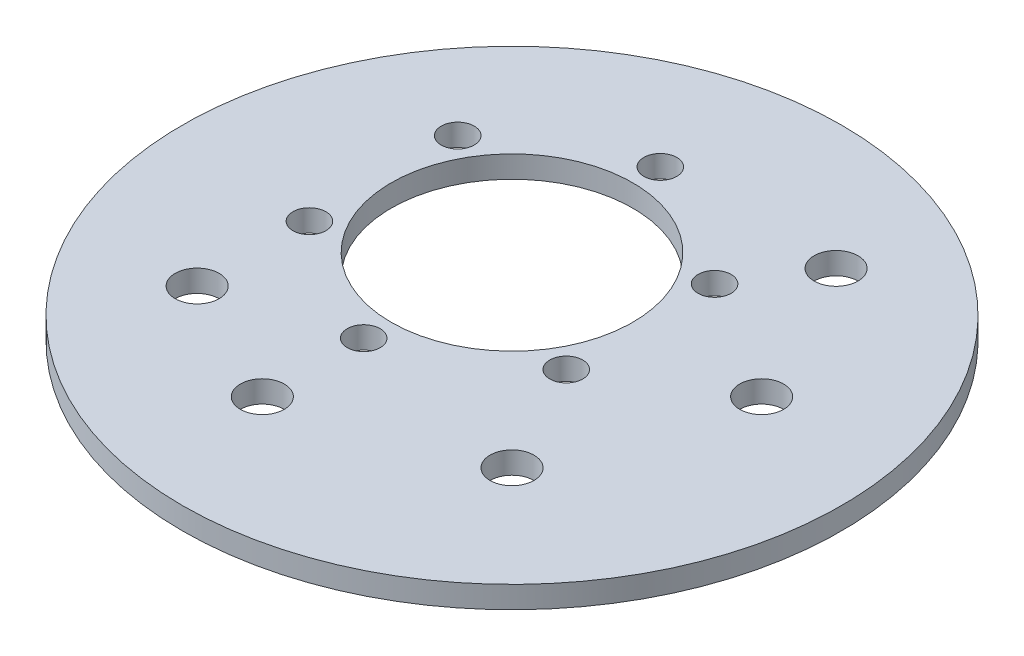
ISO-10303-21;
HEADER;
FILE_DESCRIPTION(('STEP AP214'),'2;1');
FILE_NAME('part.step','',(''),(''),'','','');
FILE_SCHEMA(('AUTOMOTIVE_DESIGN { 1 0 10303 214 1 1 1 1 }'));
ENDSEC;
DATA;
#1=APPLICATION_CONTEXT('core data for automotive mechanical design processes');
#2=APPLICATION_PROTOCOL_DEFINITION('international standard','automotive_design',2000,#1);
#3=PRODUCT_CONTEXT('',#1,'mechanical');
#4=PRODUCT('Part','Part','',(#3));
#5=PRODUCT_RELATED_PRODUCT_CATEGORY('part','',(#4));
#6=PRODUCT_DEFINITION_FORMATION('','',#4);
#7=PRODUCT_DEFINITION_CONTEXT('part definition',#1,'design');
#8=PRODUCT_DEFINITION('design','',#6,#7);
#9=PRODUCT_DEFINITION_SHAPE('','',#8);
#10=(LENGTH_UNIT() NAMED_UNIT(*) SI_UNIT(.MILLI.,.METRE.));
#11=(NAMED_UNIT(*) PLANE_ANGLE_UNIT() SI_UNIT($,.RADIAN.));
#12=(NAMED_UNIT(*) SI_UNIT($,.STERADIAN.) SOLID_ANGLE_UNIT());
#13=UNCERTAINTY_MEASURE_WITH_UNIT(LENGTH_MEASURE(1.E-05),#10,'distance_accuracy_value','');
#14=(GEOMETRIC_REPRESENTATION_CONTEXT(3) GLOBAL_UNCERTAINTY_ASSIGNED_CONTEXT((#13)) GLOBAL_UNIT_ASSIGNED_CONTEXT((#10,
#11,#12)) REPRESENTATION_CONTEXT('',''));
#15=CARTESIAN_POINT('',(0.,0.,0.));
#16=DIRECTION('',(0.,0.,1.));
#17=DIRECTION('',(1.,0.,0.));
#18=AXIS2_PLACEMENT_3D('',#15,#16,#17);
#19=CARTESIAN_POINT('',(0.,2.,0.));
#20=DIRECTION('',(0.,-1.,0.));
#21=DIRECTION('',(0.,0.,-1.));
#22=AXIS2_PLACEMENT_3D('',#19,#20,#21);
#23=CYLINDRICAL_SURFACE('',#22,30.);
#24=CARTESIAN_POINT('',(0.,2.,0.));
#25=DIRECTION('',(0.,1.,0.));
#26=DIRECTION('',(0.,0.,1.));
#27=AXIS2_PLACEMENT_3D('',#24,#25,#26);
#28=CIRCLE('',#27,30.);
#29=CARTESIAN_POINT('',(0.,2.,30.));
#30=VERTEX_POINT('',#29);
#31=EDGE_CURVE('E11',#30,#30,#28,.T.);
#32=ORIENTED_EDGE('',*,*,#31,.F.);
#33=EDGE_LOOP('',(#32));
#34=FACE_BOUND('',#33,.T.);
#35=CARTESIAN_POINT('',(0.,0.,0.));
#36=DIRECTION('',(0.,1.,0.));
#37=DIRECTION('',(0.,0.,1.));
#38=AXIS2_PLACEMENT_3D('',#35,#36,#37);
#39=CIRCLE('',#38,30.);
#40=CARTESIAN_POINT('',(0.,0.,30.));
#41=VERTEX_POINT('',#40);
#42=EDGE_CURVE('E59',#41,#41,#39,.T.);
#43=ORIENTED_EDGE('',*,*,#42,.T.);
#44=EDGE_LOOP('',(#43));
#45=FACE_BOUND('',#44,.T.);
#46=ADVANCED_FACE('F56',(#34,#45),#23,.T.);
#47=CARTESIAN_POINT('',(0.,2.,0.));
#48=DIRECTION('',(0.,1.,0.));
#49=DIRECTION('',(0.,0.,1.));
#50=AXIS2_PLACEMENT_3D('',#47,#48,#49);
#51=PLANE('',#50);
#52=CARTESIAN_POINT('',(-4.94974746830583,2.,-18.4497474683058));
#53=DIRECTION('',(0.,1.,0.));
#54=DIRECTION('',(0.,0.,1.));
#55=AXIS2_PLACEMENT_3D('',#52,#53,#54);
#56=CIRCLE('',#55,1.5);
#57=CARTESIAN_POINT('',(-4.94974746830583,2.,-16.9497474683058));
#58=VERTEX_POINT('',#57);
#59=EDGE_CURVE('E102',#58,#58,#56,.T.);
#60=ORIENTED_EDGE('',*,*,#59,.F.);
#61=EDGE_LOOP('',(#60));
#62=FACE_BOUND('',#61,.T.);
#63=CARTESIAN_POINT('',(-16.6410904193954,2.,-11.6997474683055));
#64=DIRECTION('',(0.,1.,0.));
#65=DIRECTION('',(0.,0.,1.));
#66=AXIS2_PLACEMENT_3D('',#63,#64,#65);
#67=CIRCLE('',#66,1.5);
#68=CARTESIAN_POINT('',(-16.6410904193954,2.,-10.1997474683055));
#69=VERTEX_POINT('',#68);
#70=EDGE_CURVE('E101',#69,#69,#67,.T.);
#71=ORIENTED_EDGE('',*,*,#70,.F.);
#72=EDGE_LOOP('',(#71));
#73=FACE_BOUND('',#72,.T.);
#74=CARTESIAN_POINT('',(-16.6410904193957,2.,1.80025253169417));
#75=DIRECTION('',(0.,1.,0.));
#76=DIRECTION('',(0.,0.,1.));
#77=AXIS2_PLACEMENT_3D('',#74,#75,#76);
#78=CIRCLE('',#77,1.49999999999916);
#79=CARTESIAN_POINT('',(-16.6410904193957,2.,3.30025253169333));
#80=VERTEX_POINT('',#79);
#81=EDGE_CURVE('E109',#80,#80,#78,.T.);
#82=ORIENTED_EDGE('',*,*,#81,.F.);
#83=EDGE_LOOP('',(#82));
#84=FACE_BOUND('',#83,.T.);
#85=CARTESIAN_POINT('',(-4.94974746830583,2.,8.55025253169416));
#86=DIRECTION('',(0.,1.,0.));
#87=DIRECTION('',(0.,0.,1.));
#88=AXIS2_PLACEMENT_3D('',#85,#86,#87);
#89=CIRCLE('',#88,1.499999999999);
#90=CARTESIAN_POINT('',(-4.94974746830583,2.,10.0502525316932));
#91=VERTEX_POINT('',#90);
#92=EDGE_CURVE('E115',#91,#91,#89,.T.);
#93=ORIENTED_EDGE('',*,*,#92,.F.);
#94=EDGE_LOOP('',(#93));
#95=FACE_BOUND('',#94,.T.);
#96=CARTESIAN_POINT('',(6.74159548278409,2.,1.80025253169416));
#97=DIRECTION('',(0.,1.,0.));
#98=DIRECTION('',(0.,0.,1.));
#99=AXIS2_PLACEMENT_3D('',#96,#97,#98);
#100=CIRCLE('',#99,1.49999999999939);
#101=CARTESIAN_POINT('',(6.74159548278409,2.,3.30025253169355));
#102=VERTEX_POINT('',#101);
#103=EDGE_CURVE('E78',#102,#102,#100,.T.);
#104=ORIENTED_EDGE('',*,*,#103,.F.);
#105=EDGE_LOOP('',(#104));
#106=FACE_BOUND('',#105,.T.);
#107=CARTESIAN_POINT('',(17.7776770206899,2.,-4.94974746830584));
#108=DIRECTION('',(0.,1.,0.));
#109=DIRECTION('',(0.,0.,1.));
#110=AXIS2_PLACEMENT_3D('',#107,#108,#109);
#111=CIRCLE('',#110,2.);
#112=CARTESIAN_POINT('',(17.7776770206899,2.,-2.94974746830583));
#113=VERTEX_POINT('',#112);
#114=EDGE_CURVE('E77',#113,#113,#111,.T.);
#115=ORIENTED_EDGE('',*,*,#114,.F.);
#116=EDGE_LOOP('',(#115));
#117=FACE_BOUND('',#116,.T.);
#118=CARTESIAN_POINT('',(12.0208152801713,2.,12.0208152801713));
#119=DIRECTION('',(0.,1.,0.));
#120=DIRECTION('',(0.,0.,1.));
#121=AXIS2_PLACEMENT_3D('',#118,#119,#120);
#122=CIRCLE('',#121,2.);
#123=CARTESIAN_POINT('',(12.0208152801713,2.,14.0208152801713));
#124=VERTEX_POINT('',#123);
#125=EDGE_CURVE('E85',#124,#124,#122,.T.);
#126=ORIENTED_EDGE('',*,*,#125,.F.);
#127=EDGE_LOOP('',(#126));
#128=FACE_BOUND('',#127,.T.);
#129=CARTESIAN_POINT('',(-4.94974746830583,2.,17.77767702069));
#130=DIRECTION('',(0.,1.,0.));
#131=DIRECTION('',(0.,0.,1.));
#132=AXIS2_PLACEMENT_3D('',#129,#130,#131);
#133=CIRCLE('',#132,2.);
#134=CARTESIAN_POINT('',(-4.94974746830583,2.,19.77767702069));
#135=VERTEX_POINT('',#134);
#136=EDGE_CURVE('E91',#135,#135,#133,.T.);
#137=ORIENTED_EDGE('',*,*,#136,.F.);
#138=EDGE_LOOP('',(#137));
#139=FACE_BOUND('',#138,.T.);
#140=CARTESIAN_POINT('',(-4.94974746830583,2.,-4.94974746830584));
#141=DIRECTION('',(0.,1.,0.));
#142=DIRECTION('',(0.,0.,1.));
#143=AXIS2_PLACEMENT_3D('',#140,#141,#142);
#144=CIRCLE('',#143,11.);
#145=CARTESIAN_POINT('',(-4.94974746830583,2.,6.05025253169416));
#146=VERTEX_POINT('',#145);
#147=EDGE_CURVE('E125',#146,#146,#144,.T.);
#148=ORIENTED_EDGE('',*,*,#147,.F.);
#149=EDGE_LOOP('',(#148));
#150=FACE_BOUND('',#149,.T.);
#151=CARTESIAN_POINT('',(6.7415954827844,2.,-11.6997474683063));
#152=DIRECTION('',(0.,1.,0.));
#153=DIRECTION('',(0.,0.,1.));
#154=AXIS2_PLACEMENT_3D('',#151,#152,#153);
#155=CIRCLE('',#154,1.5);
#156=CARTESIAN_POINT('',(6.7415954827844,2.,-10.1997474683063));
#157=VERTEX_POINT('',#156);
#158=EDGE_CURVE('E131',#157,#157,#155,.T.);
#159=ORIENTED_EDGE('',*,*,#158,.F.);
#160=EDGE_LOOP('',(#159));
#161=FACE_BOUND('',#160,.T.);
#162=CARTESIAN_POINT('',(11.0502525316942,2.,-18.4497474683058));
#163=DIRECTION('',(0.,1.,0.));
#164=DIRECTION('',(0.,0.,1.));
#165=AXIS2_PLACEMENT_3D('',#162,#163,#164);
#166=CIRCLE('',#165,2.);
#167=CARTESIAN_POINT('',(11.0502525316942,2.,-16.4497474683058));
#168=VERTEX_POINT('',#167);
#169=EDGE_CURVE('E126',#168,#168,#166,.T.);
#170=ORIENTED_EDGE('',*,*,#169,.F.);
#171=EDGE_LOOP('',(#170));
#172=FACE_BOUND('',#171,.T.);
#173=CARTESIAN_POINT('',(-16.6410904193957,2.,12.0208152801713));
#174=DIRECTION('',(0.,1.,0.));
#175=DIRECTION('',(0.,0.,1.));
#176=AXIS2_PLACEMENT_3D('',#173,#174,#175);
#177=CIRCLE('',#176,2.);
#178=CARTESIAN_POINT('',(-16.6410904193957,2.,14.0208152801713));
#179=VERTEX_POINT('',#178);
#180=EDGE_CURVE('E70',#179,#179,#177,.T.);
#181=ORIENTED_EDGE('',*,*,#180,.F.);
#182=EDGE_LOOP('',(#181));
#183=FACE_BOUND('',#182,.T.);
#184=ORIENTED_EDGE('',*,*,#31,.T.);
#185=EDGE_LOOP('',(#184));
#186=FACE_BOUND('',#185,.T.);
#187=ADVANCED_FACE('F143',(#62,#73,#84,#95,#106,#117,#128,#139,#150,#161,#172,#183,#186),#51,.T.);
#188=CARTESIAN_POINT('',(0.,0.,0.));
#189=DIRECTION('',(0.,1.,0.));
#190=DIRECTION('',(0.,0.,1.));
#191=AXIS2_PLACEMENT_3D('',#188,#189,#190);
#192=PLANE('',#191);
#193=CARTESIAN_POINT('',(-4.94974746830583,0.,-18.4497474683058));
#194=DIRECTION('',(0.,1.,0.));
#195=DIRECTION('',(0.,0.,1.));
#196=AXIS2_PLACEMENT_3D('',#193,#194,#195);
#197=CIRCLE('',#196,1.5);
#198=CARTESIAN_POINT('',(-4.94974746830583,0.,-16.9497474683058));
#199=VERTEX_POINT('',#198);
#200=EDGE_CURVE('E98',#199,#199,#197,.F.);
#201=ORIENTED_EDGE('',*,*,#200,.F.);
#202=EDGE_LOOP('',(#201));
#203=FACE_BOUND('',#202,.T.);
#204=CARTESIAN_POINT('',(-16.6410904193954,0.,-11.6997474683055));
#205=DIRECTION('',(0.,1.,0.));
#206=DIRECTION('',(0.,0.,1.));
#207=AXIS2_PLACEMENT_3D('',#204,#205,#206);
#208=CIRCLE('',#207,1.5);
#209=CARTESIAN_POINT('',(-16.6410904193954,0.,-10.1997474683055));
#210=VERTEX_POINT('',#209);
#211=EDGE_CURVE('E106',#210,#210,#208,.F.);
#212=ORIENTED_EDGE('',*,*,#211,.F.);
#213=EDGE_LOOP('',(#212));
#214=FACE_BOUND('',#213,.T.);
#215=CARTESIAN_POINT('',(-16.6410904193957,0.,1.80025253169417));
#216=DIRECTION('',(0.,1.,0.));
#217=DIRECTION('',(0.,0.,1.));
#218=AXIS2_PLACEMENT_3D('',#215,#216,#217);
#219=CIRCLE('',#218,1.49999999999916);
#220=CARTESIAN_POINT('',(-16.6410904193957,0.,3.30025253169333));
#221=VERTEX_POINT('',#220);
#222=EDGE_CURVE('E112',#221,#221,#219,.F.);
#223=ORIENTED_EDGE('',*,*,#222,.F.);
#224=EDGE_LOOP('',(#223));
#225=FACE_BOUND('',#224,.T.);
#226=CARTESIAN_POINT('',(-4.94974746830583,0.,8.55025253169416));
#227=DIRECTION('',(0.,1.,0.));
#228=DIRECTION('',(0.,0.,1.));
#229=AXIS2_PLACEMENT_3D('',#226,#227,#228);
#230=CIRCLE('',#229,1.499999999999);
#231=CARTESIAN_POINT('',(-4.94974746830583,0.,10.0502525316932));
#232=VERTEX_POINT('',#231);
#233=EDGE_CURVE('E81',#232,#232,#230,.F.);
#234=ORIENTED_EDGE('',*,*,#233,.F.);
#235=EDGE_LOOP('',(#234));
#236=FACE_BOUND('',#235,.T.);
#237=CARTESIAN_POINT('',(6.74159548278409,0.,1.80025253169416));
#238=DIRECTION('',(0.,1.,0.));
#239=DIRECTION('',(0.,0.,1.));
#240=AXIS2_PLACEMENT_3D('',#237,#238,#239);
#241=CIRCLE('',#240,1.49999999999939);
#242=CARTESIAN_POINT('',(6.74159548278409,0.,3.30025253169355));
#243=VERTEX_POINT('',#242);
#244=EDGE_CURVE('E74',#243,#243,#241,.F.);
#245=ORIENTED_EDGE('',*,*,#244,.F.);
#246=EDGE_LOOP('',(#245));
#247=FACE_BOUND('',#246,.T.);
#248=CARTESIAN_POINT('',(17.7776770206899,0.,-4.94974746830584));
#249=DIRECTION('',(0.,1.,0.));
#250=DIRECTION('',(0.,0.,1.));
#251=AXIS2_PLACEMENT_3D('',#248,#249,#250);
#252=CIRCLE('',#251,2.);
#253=CARTESIAN_POINT('',(17.7776770206899,0.,-2.94974746830583));
#254=VERTEX_POINT('',#253);
#255=EDGE_CURVE('E82',#254,#254,#252,.F.);
#256=ORIENTED_EDGE('',*,*,#255,.F.);
#257=EDGE_LOOP('',(#256));
#258=FACE_BOUND('',#257,.T.);
#259=CARTESIAN_POINT('',(12.0208152801713,0.,12.0208152801713));
#260=DIRECTION('',(0.,1.,0.));
#261=DIRECTION('',(0.,0.,1.));
#262=AXIS2_PLACEMENT_3D('',#259,#260,#261);
#263=CIRCLE('',#262,2.);
#264=CARTESIAN_POINT('',(12.0208152801713,0.,14.0208152801713));
#265=VERTEX_POINT('',#264);
#266=EDGE_CURVE('E88',#265,#265,#263,.F.);
#267=ORIENTED_EDGE('',*,*,#266,.F.);
#268=EDGE_LOOP('',(#267));
#269=FACE_BOUND('',#268,.T.);
#270=CARTESIAN_POINT('',(-4.94974746830583,0.,17.77767702069));
#271=DIRECTION('',(0.,1.,0.));
#272=DIRECTION('',(0.,0.,1.));
#273=AXIS2_PLACEMENT_3D('',#270,#271,#272);
#274=CIRCLE('',#273,2.);
#275=CARTESIAN_POINT('',(-4.94974746830583,0.,19.77767702069));
#276=VERTEX_POINT('',#275);
#277=EDGE_CURVE('E73',#276,#276,#274,.F.);
#278=ORIENTED_EDGE('',*,*,#277,.F.);
#279=EDGE_LOOP('',(#278));
#280=FACE_BOUND('',#279,.T.);
#281=CARTESIAN_POINT('',(-4.94974746830583,0.,-4.94974746830584));
#282=DIRECTION('',(0.,1.,0.));
#283=DIRECTION('',(0.,0.,1.));
#284=AXIS2_PLACEMENT_3D('',#281,#282,#283);
#285=CIRCLE('',#284,11.);
#286=CARTESIAN_POINT('',(-4.94974746830583,0.,6.05025253169416));
#287=VERTEX_POINT('',#286);
#288=EDGE_CURVE('E134',#287,#287,#285,.F.);
#289=ORIENTED_EDGE('',*,*,#288,.F.);
#290=EDGE_LOOP('',(#289));
#291=FACE_BOUND('',#290,.T.);
#292=CARTESIAN_POINT('',(6.7415954827844,0.,-11.6997474683063));
#293=DIRECTION('',(0.,1.,0.));
#294=DIRECTION('',(0.,0.,1.));
#295=AXIS2_PLACEMENT_3D('',#292,#293,#294);
#296=CIRCLE('',#295,1.5);
#297=CARTESIAN_POINT('',(6.7415954827844,0.,-10.1997474683063));
#298=VERTEX_POINT('',#297);
#299=EDGE_CURVE('E105',#298,#298,#296,.F.);
#300=ORIENTED_EDGE('',*,*,#299,.F.);
#301=EDGE_LOOP('',(#300));
#302=FACE_BOUND('',#301,.T.);
#303=CARTESIAN_POINT('',(11.0502525316942,0.,-18.4497474683058));
#304=DIRECTION('',(0.,1.,0.));
#305=DIRECTION('',(0.,0.,1.));
#306=AXIS2_PLACEMENT_3D('',#303,#304,#305);
#307=CIRCLE('',#306,2.);
#308=CARTESIAN_POINT('',(11.0502525316942,0.,-16.4497474683058));
#309=VERTEX_POINT('',#308);
#310=EDGE_CURVE('E122',#309,#309,#307,.F.);
#311=ORIENTED_EDGE('',*,*,#310,.F.);
#312=EDGE_LOOP('',(#311));
#313=FACE_BOUND('',#312,.T.);
#314=CARTESIAN_POINT('',(-16.6410904193957,0.,12.0208152801713));
#315=DIRECTION('',(0.,1.,0.));
#316=DIRECTION('',(0.,0.,1.));
#317=AXIS2_PLACEMENT_3D('',#314,#315,#316);
#318=CIRCLE('',#317,2.);
#319=CARTESIAN_POINT('',(-16.6410904193957,0.,14.0208152801713));
#320=VERTEX_POINT('',#319);
#321=EDGE_CURVE('E66',#320,#320,#318,.F.);
#322=ORIENTED_EDGE('',*,*,#321,.F.);
#323=EDGE_LOOP('',(#322));
#324=FACE_BOUND('',#323,.T.);
#325=ORIENTED_EDGE('',*,*,#42,.F.);
#326=EDGE_LOOP('',(#325));
#327=FACE_BOUND('',#326,.T.);
#328=ADVANCED_FACE('F146',(#203,#214,#225,#236,#247,#258,#269,#280,#291,#302,#313,#324,#327),
#192,.F.);
#329=CARTESIAN_POINT('',(-16.6410904193957,-0.00100000000000013,12.0208152801713));
#330=DIRECTION('',(0.,1.,0.));
#331=DIRECTION('',(0.,0.,1.));
#332=AXIS2_PLACEMENT_3D('',#329,#330,#331);
#333=CYLINDRICAL_SURFACE('',#332,2.);
#334=ORIENTED_EDGE('',*,*,#180,.T.);
#335=EDGE_LOOP('',(#334));
#336=FACE_BOUND('',#335,.T.);
#337=ORIENTED_EDGE('',*,*,#321,.T.);
#338=EDGE_LOOP('',(#337));
#339=FACE_BOUND('',#338,.T.);
#340=ADVANCED_FACE('F155',(#336,#339),#333,.F.);
#341=CARTESIAN_POINT('',(11.0502525316942,-0.00100000000000013,-18.4497474683058));
#342=DIRECTION('',(0.,1.,0.));
#343=DIRECTION('',(0.,0.,1.));
#344=AXIS2_PLACEMENT_3D('',#341,#342,#343);
#345=CYLINDRICAL_SURFACE('',#344,2.);
#346=ORIENTED_EDGE('',*,*,#169,.T.);
#347=EDGE_LOOP('',(#346));
#348=FACE_BOUND('',#347,.T.);
#349=ORIENTED_EDGE('',*,*,#310,.T.);
#350=EDGE_LOOP('',(#349));
#351=FACE_BOUND('',#350,.T.);
#352=ADVANCED_FACE('F158',(#348,#351),#345,.F.);
#353=CARTESIAN_POINT('',(6.7415954827844,-0.00100000000000013,-11.6997474683063));
#354=DIRECTION('',(0.,1.,0.));
#355=DIRECTION('',(0.,0.,1.));
#356=AXIS2_PLACEMENT_3D('',#353,#354,#355);
#357=CYLINDRICAL_SURFACE('',#356,1.5);
#358=ORIENTED_EDGE('',*,*,#158,.T.);
#359=EDGE_LOOP('',(#358));
#360=FACE_BOUND('',#359,.T.);
#361=ORIENTED_EDGE('',*,*,#299,.T.);
#362=EDGE_LOOP('',(#361));
#363=FACE_BOUND('',#362,.T.);
#364=ADVANCED_FACE('F189',(#360,#363),#357,.F.);
#365=CARTESIAN_POINT('',(-4.94974746830583,-0.00100000000000013,-4.94974746830584));
#366=DIRECTION('',(0.,1.,0.));
#367=DIRECTION('',(0.,0.,1.));
#368=AXIS2_PLACEMENT_3D('',#365,#366,#367);
#369=CYLINDRICAL_SURFACE('',#368,11.);
#370=ORIENTED_EDGE('',*,*,#147,.T.);
#371=EDGE_LOOP('',(#370));
#372=FACE_BOUND('',#371,.T.);
#373=ORIENTED_EDGE('',*,*,#288,.T.);
#374=EDGE_LOOP('',(#373));
#375=FACE_BOUND('',#374,.T.);
#376=ADVANCED_FACE('F140',(#372,#375),#369,.F.);
#377=CARTESIAN_POINT('',(-4.94974746830583,-0.00100000000000013,17.77767702069));
#378=DIRECTION('',(0.,1.,0.));
#379=DIRECTION('',(0.,0.,1.));
#380=AXIS2_PLACEMENT_3D('',#377,#378,#379);
#381=CYLINDRICAL_SURFACE('',#380,2.);
#382=ORIENTED_EDGE('',*,*,#136,.T.);
#383=EDGE_LOOP('',(#382));
#384=FACE_BOUND('',#383,.T.);
#385=ORIENTED_EDGE('',*,*,#277,.T.);
#386=EDGE_LOOP('',(#385));
#387=FACE_BOUND('',#386,.T.);
#388=ADVANCED_FACE('F204',(#384,#387),#381,.F.);
#389=CARTESIAN_POINT('',(12.0208152801713,-0.00100000000000013,12.0208152801713));
#390=DIRECTION('',(0.,1.,0.));
#391=DIRECTION('',(0.,0.,1.));
#392=AXIS2_PLACEMENT_3D('',#389,#390,#391);
#393=CYLINDRICAL_SURFACE('',#392,2.);
#394=ORIENTED_EDGE('',*,*,#125,.T.);
#395=EDGE_LOOP('',(#394));
#396=FACE_BOUND('',#395,.T.);
#397=ORIENTED_EDGE('',*,*,#266,.T.);
#398=EDGE_LOOP('',(#397));
#399=FACE_BOUND('',#398,.T.);
#400=ADVANCED_FACE('F211',(#396,#399),#393,.F.);
#401=CARTESIAN_POINT('',(17.7776770206899,-0.00100000000000013,-4.94974746830584));
#402=DIRECTION('',(0.,1.,0.));
#403=DIRECTION('',(0.,0.,1.));
#404=AXIS2_PLACEMENT_3D('',#401,#402,#403);
#405=CYLINDRICAL_SURFACE('',#404,2.);
#406=ORIENTED_EDGE('',*,*,#114,.T.);
#407=EDGE_LOOP('',(#406));
#408=FACE_BOUND('',#407,.T.);
#409=ORIENTED_EDGE('',*,*,#255,.T.);
#410=EDGE_LOOP('',(#409));
#411=FACE_BOUND('',#410,.T.);
#412=ADVANCED_FACE('F219',(#408,#411),#405,.F.);
#413=CARTESIAN_POINT('',(6.74159548278409,-0.00100000000000013,1.80025253169416));
#414=DIRECTION('',(0.,1.,0.));
#415=DIRECTION('',(0.,0.,1.));
#416=AXIS2_PLACEMENT_3D('',#413,#414,#415);
#417=CYLINDRICAL_SURFACE('',#416,1.49999999999939);
#418=ORIENTED_EDGE('',*,*,#103,.T.);
#419=EDGE_LOOP('',(#418));
#420=FACE_BOUND('',#419,.T.);
#421=ORIENTED_EDGE('',*,*,#244,.T.);
#422=EDGE_LOOP('',(#421));
#423=FACE_BOUND('',#422,.T.);
#424=ADVANCED_FACE('F227',(#420,#423),#417,.F.);
#425=CARTESIAN_POINT('',(-4.94974746830583,-0.00100000000000013,8.55025253169416));
#426=DIRECTION('',(0.,1.,0.));
#427=DIRECTION('',(0.,0.,1.));
#428=AXIS2_PLACEMENT_3D('',#425,#426,#427);
#429=CYLINDRICAL_SURFACE('',#428,1.499999999999);
#430=ORIENTED_EDGE('',*,*,#92,.T.);
#431=EDGE_LOOP('',(#430));
#432=FACE_BOUND('',#431,.T.);
#433=ORIENTED_EDGE('',*,*,#233,.T.);
#434=EDGE_LOOP('',(#433));
#435=FACE_BOUND('',#434,.T.);
#436=ADVANCED_FACE('F235',(#432,#435),#429,.F.);
#437=CARTESIAN_POINT('',(-16.6410904193957,-0.00100000000000013,1.80025253169417));
#438=DIRECTION('',(0.,1.,0.));
#439=DIRECTION('',(0.,0.,1.));
#440=AXIS2_PLACEMENT_3D('',#437,#438,#439);
#441=CYLINDRICAL_SURFACE('',#440,1.49999999999916);
#442=ORIENTED_EDGE('',*,*,#81,.T.);
#443=EDGE_LOOP('',(#442));
#444=FACE_BOUND('',#443,.T.);
#445=ORIENTED_EDGE('',*,*,#222,.T.);
#446=EDGE_LOOP('',(#445));
#447=FACE_BOUND('',#446,.T.);
#448=ADVANCED_FACE('F243',(#444,#447),#441,.F.);
#449=CARTESIAN_POINT('',(-16.6410904193954,-0.00100000000000013,-11.6997474683055));
#450=DIRECTION('',(0.,1.,0.));
#451=DIRECTION('',(0.,0.,1.));
#452=AXIS2_PLACEMENT_3D('',#449,#450,#451);
#453=CYLINDRICAL_SURFACE('',#452,1.5);
#454=ORIENTED_EDGE('',*,*,#70,.T.);
#455=EDGE_LOOP('',(#454));
#456=FACE_BOUND('',#455,.T.);
#457=ORIENTED_EDGE('',*,*,#211,.T.);
#458=EDGE_LOOP('',(#457));
#459=FACE_BOUND('',#458,.T.);
#460=ADVANCED_FACE('F251',(#456,#459),#453,.F.);
#461=CARTESIAN_POINT('',(-4.94974746830583,-0.00100000000000013,-18.4497474683058));
#462=DIRECTION('',(0.,1.,0.));
#463=DIRECTION('',(0.,0.,1.));
#464=AXIS2_PLACEMENT_3D('',#461,#462,#463);
#465=CYLINDRICAL_SURFACE('',#464,1.5);
#466=ORIENTED_EDGE('',*,*,#59,.T.);
#467=EDGE_LOOP('',(#466));
#468=FACE_BOUND('',#467,.T.);
#469=ORIENTED_EDGE('',*,*,#200,.T.);
#470=EDGE_LOOP('',(#469));
#471=FACE_BOUND('',#470,.T.);
#472=ADVANCED_FACE('F259',(#468,#471),#465,.F.);
#473=CLOSED_SHELL('',(#46,#187,#328,#340,#352,#364,#376,#388,#400,#412,#424,#436,#448,#460,#472));
#474=MANIFOLD_SOLID_BREP('B2',#473);
#475=ADVANCED_BREP_SHAPE_REPRESENTATION('',(#18,#474),#14);
#476=SHAPE_DEFINITION_REPRESENTATION(#9,#475);
ENDSEC;
END-ISO-10303-21;
